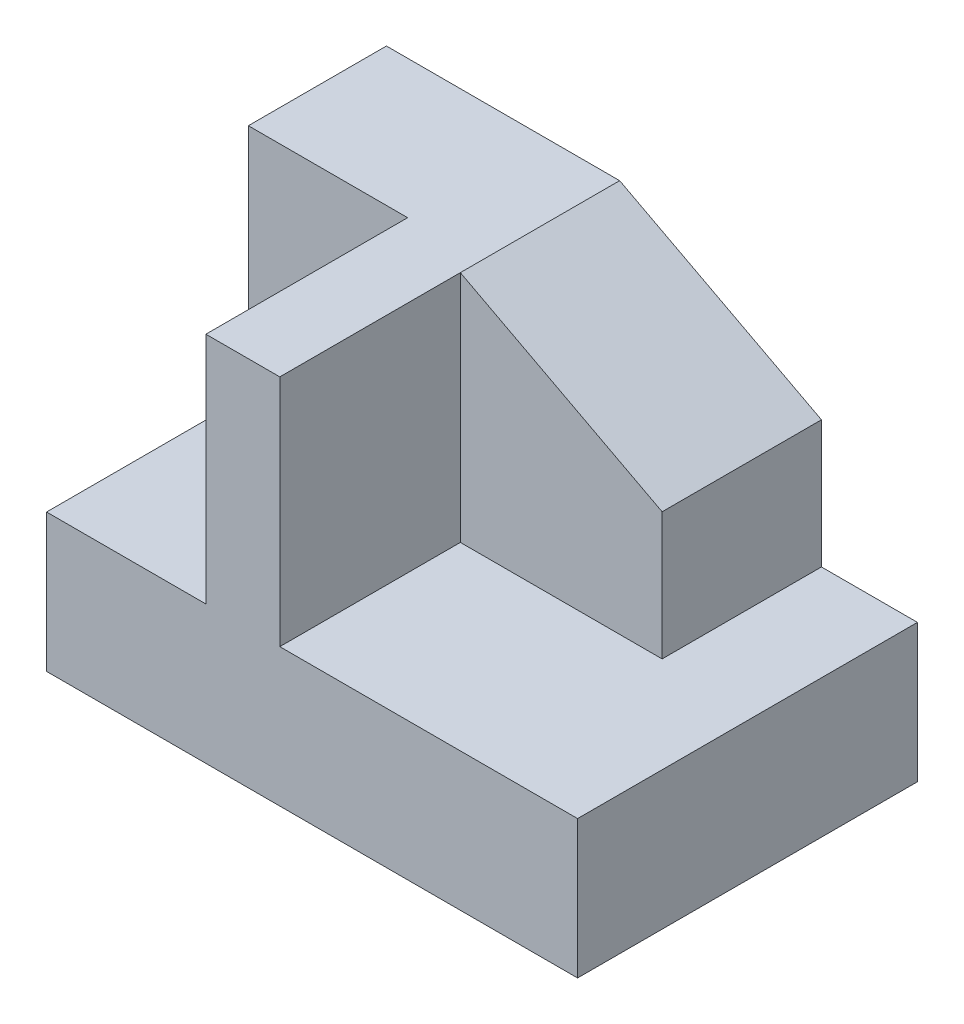
ISO-10303-21;
HEADER;
FILE_DESCRIPTION(('STEP AP214'),'2;1');
FILE_NAME('part.step','',(''),(''),'','','');
FILE_SCHEMA(('AUTOMOTIVE_DESIGN { 1 0 10303 214 1 1 1 1 }'));
ENDSEC;
DATA;
#1=APPLICATION_CONTEXT('core data for automotive mechanical design processes');
#2=APPLICATION_PROTOCOL_DEFINITION('international standard','automotive_design',2000,#1);
#3=PRODUCT_CONTEXT('',#1,'mechanical');
#4=PRODUCT('Part','Part','',(#3));
#5=PRODUCT_RELATED_PRODUCT_CATEGORY('part','',(#4));
#6=PRODUCT_DEFINITION_FORMATION('','',#4);
#7=PRODUCT_DEFINITION_CONTEXT('part definition',#1,'design');
#8=PRODUCT_DEFINITION('design','',#6,#7);
#9=PRODUCT_DEFINITION_SHAPE('','',#8);
#10=(LENGTH_UNIT() NAMED_UNIT(*) SI_UNIT(.MILLI.,.METRE.));
#11=(NAMED_UNIT(*) PLANE_ANGLE_UNIT() SI_UNIT($,.RADIAN.));
#12=(NAMED_UNIT(*) SI_UNIT($,.STERADIAN.) SOLID_ANGLE_UNIT());
#13=UNCERTAINTY_MEASURE_WITH_UNIT(LENGTH_MEASURE(1.E-05),#10,'distance_accuracy_value','');
#14=(GEOMETRIC_REPRESENTATION_CONTEXT(3) GLOBAL_UNCERTAINTY_ASSIGNED_CONTEXT((#13)) GLOBAL_UNIT_ASSIGNED_CONTEXT((#10,
#11,#12)) REPRESENTATION_CONTEXT('',''));
#15=CARTESIAN_POINT('',(0.,0.,0.));
#16=DIRECTION('',(0.,0.,1.));
#17=DIRECTION('',(1.,0.,0.));
#18=AXIS2_PLACEMENT_3D('',#15,#16,#17);
#19=CARTESIAN_POINT('',(-3.03861173426391,13.,-16.));
#20=DIRECTION('',(1.,0.,0.));
#21=DIRECTION('',(0.,0.,-1.));
#22=AXIS2_PLACEMENT_3D('',#19,#20,#21);
#23=PLANE('',#22);
#24=DIRECTION('',(0.,1.,0.));
#25=VECTOR('',#24,1.);
#26=CARTESIAN_POINT('',(-3.03861173426391,13.,-1.00000000000001));
#27=LINE('',#26,#25);
#28=CARTESIAN_POINT('',(-3.03861173426391,13.,-1.00000000000001));
#29=VERTEX_POINT('',#28);
#30=CARTESIAN_POINT('',(-3.03861173426391,35.,-1.00000000000001));
#31=VERTEX_POINT('',#30);
#32=EDGE_CURVE('E54',#29,#31,#27,.T.);
#33=ORIENTED_EDGE('',*,*,#32,.T.);
#34=DIRECTION('',(0.,0.,1.));
#35=VECTOR('',#34,1.);
#36=CARTESIAN_POINT('',(-3.03861173426391,35.,-16.));
#37=LINE('',#36,#35);
#38=CARTESIAN_POINT('',(-3.03861173426391,35.,16.));
#39=VERTEX_POINT('',#38);
#40=EDGE_CURVE('E169',#31,#39,#37,.T.);
#41=ORIENTED_EDGE('',*,*,#40,.T.);
#42=DIRECTION('',(0.,1.,0.));
#43=VECTOR('',#42,1.);
#44=CARTESIAN_POINT('',(-3.03861173426391,13.,16.));
#45=LINE('',#44,#43);
#46=CARTESIAN_POINT('',(-3.03861173426391,13.,16.));
#47=VERTEX_POINT('',#46);
#48=EDGE_CURVE('E158',#47,#39,#45,.T.);
#49=ORIENTED_EDGE('',*,*,#48,.F.);
#50=DIRECTION('',(0.,0.,1.));
#51=VECTOR('',#50,1.);
#52=CARTESIAN_POINT('',(-3.03861173426391,13.,-16.));
#53=LINE('',#52,#51);
#54=EDGE_CURVE('E170',#29,#47,#53,.T.);
#55=ORIENTED_EDGE('',*,*,#54,.F.);
#56=EDGE_LOOP('',(#33,#41,#49,#55));
#57=FACE_BOUND('',#56,.T.);
#58=ADVANCED_FACE('F39',(#57),#23,.T.);
#59=CARTESIAN_POINT('',(0.,13.,0.));
#60=DIRECTION('',(0.,-1.,0.));
#61=DIRECTION('',(0.,0.,-1.));
#62=AXIS2_PLACEMENT_3D('',#59,#60,#61);
#63=PLANE('',#62);
#64=DIRECTION('',(1.,0.,0.));
#65=VECTOR('',#64,1.);
#66=CARTESIAN_POINT('',(-25.,13.,16.));
#67=LINE('',#66,#65);
#68=CARTESIAN_POINT('',(-25.,13.,16.));
#69=VERTEX_POINT('',#68);
#70=CARTESIAN_POINT('',(-10.,13.,16.));
#71=VERTEX_POINT('',#70);
#72=EDGE_CURVE('E200',#69,#71,#67,.T.);
#73=ORIENTED_EDGE('',*,*,#72,.T.);
#74=DIRECTION('',(0.,0.,1.));
#75=VECTOR('',#74,1.);
#76=CARTESIAN_POINT('',(-10.,13.,-16.));
#77=LINE('',#76,#75);
#78=CARTESIAN_POINT('',(-10.,13.,-3.00000000000001));
#79=VERTEX_POINT('',#78);
#80=EDGE_CURVE('E164',#79,#71,#77,.T.);
#81=ORIENTED_EDGE('',*,*,#80,.F.);
#82=DIRECTION('',(-1.,0.,0.));
#83=VECTOR('',#82,1.);
#84=CARTESIAN_POINT('',(-25.,13.,-3.00000000000001));
#85=LINE('',#84,#83);
#86=CARTESIAN_POINT('',(-25.,13.,-3.00000000000001));
#87=VERTEX_POINT('',#86);
#88=EDGE_CURVE('E183',#79,#87,#85,.T.);
#89=ORIENTED_EDGE('',*,*,#88,.T.);
#90=DIRECTION('',(0.,0.,1.));
#91=VECTOR('',#90,1.);
#92=CARTESIAN_POINT('',(-25.,13.,16.));
#93=LINE('',#92,#91);
#94=EDGE_CURVE('E197',#87,#69,#93,.T.);
#95=ORIENTED_EDGE('',*,*,#94,.T.);
#96=EDGE_LOOP('',(#73,#81,#89,#95));
#97=FACE_BOUND('',#96,.T.);
#98=ADVANCED_FACE('F244',(#97),#63,.F.);
#99=DIRECTION('',(-1.,0.,0.));
#100=VECTOR('',#99,1.);
#101=CARTESIAN_POINT('',(-25.,13.,-16.));
#102=LINE('',#101,#100);
#103=CARTESIAN_POINT('',(25.,13.,-16.));
#104=VERTEX_POINT('',#103);
#105=CARTESIAN_POINT('',(15.9613882657361,13.,-16.));
#106=VERTEX_POINT('',#105);
#107=EDGE_CURVE('E194',#104,#106,#102,.T.);
#108=ORIENTED_EDGE('',*,*,#107,.T.);
#109=DIRECTION('',(0.,0.,-1.));
#110=VECTOR('',#109,1.);
#111=CARTESIAN_POINT('',(15.9613882657361,13.,-1.00000000000001));
#112=LINE('',#111,#110);
#113=CARTESIAN_POINT('',(15.9613882657361,13.,-1.00000000000001));
#114=VERTEX_POINT('',#113);
#115=EDGE_CURVE('E62',#114,#106,#112,.T.);
#116=ORIENTED_EDGE('',*,*,#115,.F.);
#117=DIRECTION('',(-1.,0.,0.));
#118=VECTOR('',#117,1.);
#119=CARTESIAN_POINT('',(-3.03861173426391,13.,-1.00000000000001));
#120=LINE('',#119,#118);
#121=EDGE_CURVE('E131',#114,#29,#120,.T.);
#122=ORIENTED_EDGE('',*,*,#121,.T.);
#123=ORIENTED_EDGE('',*,*,#54,.T.);
#124=CARTESIAN_POINT('',(25.,13.,16.));
#125=VERTEX_POINT('',#124);
#126=EDGE_CURVE('E199',#47,#125,#67,.T.);
#127=ORIENTED_EDGE('',*,*,#126,.T.);
#128=DIRECTION('',(0.,0.,-1.));
#129=VECTOR('',#128,1.);
#130=CARTESIAN_POINT('',(25.,13.,16.));
#131=LINE('',#130,#129);
#132=EDGE_CURVE('E191',#125,#104,#131,.T.);
#133=ORIENTED_EDGE('',*,*,#132,.T.);
#134=EDGE_LOOP('',(#108,#116,#122,#123,#127,#133));
#135=FACE_BOUND('',#134,.T.);
#136=ADVANCED_FACE('F233',(#135),#63,.F.);
#137=CARTESIAN_POINT('',(25.,13.,16.));
#138=DIRECTION('',(-1.,0.,0.));
#139=DIRECTION('',(0.,0.,1.));
#140=AXIS2_PLACEMENT_3D('',#137,#138,#139);
#141=PLANE('',#140);
#142=DIRECTION('',(0.,0.,-1.));
#143=VECTOR('',#142,1.);
#144=CARTESIAN_POINT('',(25.,0.,16.));
#145=LINE('',#144,#143);
#146=CARTESIAN_POINT('',(25.,0.,16.));
#147=VERTEX_POINT('',#146);
#148=CARTESIAN_POINT('',(25.,0.,-16.));
#149=VERTEX_POINT('',#148);
#150=EDGE_CURVE('E190',#147,#149,#145,.T.);
#151=ORIENTED_EDGE('',*,*,#150,.T.);
#152=DIRECTION('',(0.,-1.,0.));
#153=VECTOR('',#152,1.);
#154=CARTESIAN_POINT('',(25.,13.,-16.));
#155=LINE('',#154,#153);
#156=EDGE_CURVE('E11',#104,#149,#155,.T.);
#157=ORIENTED_EDGE('',*,*,#156,.F.);
#158=ORIENTED_EDGE('',*,*,#132,.F.);
#159=DIRECTION('',(0.,-1.,0.));
#160=VECTOR('',#159,1.);
#161=CARTESIAN_POINT('',(25.,13.,16.));
#162=LINE('',#161,#160);
#163=EDGE_CURVE('E202',#125,#147,#162,.T.);
#164=ORIENTED_EDGE('',*,*,#163,.T.);
#165=EDGE_LOOP('',(#151,#157,#158,#164));
#166=FACE_BOUND('',#165,.T.);
#167=ADVANCED_FACE('F41',(#166),#141,.F.);
#168=CARTESIAN_POINT('',(-25.,13.,-16.));
#169=DIRECTION('',(0.,0.,1.));
#170=DIRECTION('',(1.,0.,0.));
#171=AXIS2_PLACEMENT_3D('',#168,#169,#170);
#172=PLANE('',#171);
#173=DIRECTION('',(1.,0.,0.));
#174=VECTOR('',#173,1.);
#175=CARTESIAN_POINT('',(-25.,35.,-16.));
#176=LINE('',#175,#174);
#177=CARTESIAN_POINT('',(-25.,35.,-16.));
#178=VERTEX_POINT('',#177);
#179=CARTESIAN_POINT('',(-3.03861173426391,35.,-16.));
#180=VERTEX_POINT('',#179);
#181=EDGE_CURVE('E167',#178,#180,#176,.T.);
#182=ORIENTED_EDGE('',*,*,#181,.T.);
#183=DIRECTION('',(0.884918222381982,-0.465746432832622,0.));
#184=VECTOR('',#183,1.);
#185=CARTESIAN_POINT('',(15.9613882657361,25.,-16.));
#186=LINE('',#185,#184);
#187=CARTESIAN_POINT('',(15.9613882657361,25.,-16.));
#188=VERTEX_POINT('',#187);
#189=EDGE_CURVE('E147',#180,#188,#186,.T.);
#190=ORIENTED_EDGE('',*,*,#189,.T.);
#191=DIRECTION('',(0.,-1.,0.));
#192=VECTOR('',#191,1.);
#193=CARTESIAN_POINT('',(15.9613882657361,13.,-16.));
#194=LINE('',#193,#192);
#195=EDGE_CURVE('E138',#188,#106,#194,.T.);
#196=ORIENTED_EDGE('',*,*,#195,.T.);
#197=ORIENTED_EDGE('',*,*,#107,.F.);
#198=ORIENTED_EDGE('',*,*,#156,.T.);
#199=DIRECTION('',(-1.,0.,0.));
#200=VECTOR('',#199,1.);
#201=CARTESIAN_POINT('',(-25.,0.,-16.));
#202=LINE('',#201,#200);
#203=CARTESIAN_POINT('',(-25.,0.,-16.));
#204=VERTEX_POINT('',#203);
#205=EDGE_CURVE('E205',#149,#204,#202,.T.);
#206=ORIENTED_EDGE('',*,*,#205,.T.);
#207=DIRECTION('',(0.,-1.,0.));
#208=VECTOR('',#207,1.);
#209=CARTESIAN_POINT('',(-25.,13.,-16.));
#210=LINE('',#209,#208);
#211=EDGE_CURVE('E47',#178,#204,#210,.T.);
#212=ORIENTED_EDGE('',*,*,#211,.F.);
#213=EDGE_LOOP('',(#182,#190,#196,#197,#198,#206,#212));
#214=FACE_BOUND('',#213,.T.);
#215=ADVANCED_FACE('F249',(#214),#172,.F.);
#216=CARTESIAN_POINT('',(-25.,13.,16.));
#217=DIRECTION('',(1.,0.,0.));
#218=DIRECTION('',(0.,0.,-1.));
#219=AXIS2_PLACEMENT_3D('',#216,#217,#218);
#220=PLANE('',#219);
#221=DIRECTION('',(0.,0.,1.));
#222=VECTOR('',#221,1.);
#223=CARTESIAN_POINT('',(-25.,0.,16.));
#224=LINE('',#223,#222);
#225=CARTESIAN_POINT('',(-25.,0.,16.));
#226=VERTEX_POINT('',#225);
#227=EDGE_CURVE('E207',#204,#226,#224,.T.);
#228=ORIENTED_EDGE('',*,*,#227,.T.);
#229=DIRECTION('',(0.,-1.,0.));
#230=VECTOR('',#229,1.);
#231=CARTESIAN_POINT('',(-25.,13.,16.));
#232=LINE('',#231,#230);
#233=EDGE_CURVE('E212',#69,#226,#232,.T.);
#234=ORIENTED_EDGE('',*,*,#233,.F.);
#235=ORIENTED_EDGE('',*,*,#94,.F.);
#236=DIRECTION('',(0.,1.,0.));
#237=VECTOR('',#236,1.);
#238=CARTESIAN_POINT('',(-25.,13.,-3.00000000000001));
#239=LINE('',#238,#237);
#240=CARTESIAN_POINT('',(-25.,35.,-3.00000000000001));
#241=VERTEX_POINT('',#240);
#242=EDGE_CURVE('E174',#87,#241,#239,.T.);
#243=ORIENTED_EDGE('',*,*,#242,.T.);
#244=DIRECTION('',(0.,0.,-1.));
#245=VECTOR('',#244,1.);
#246=CARTESIAN_POINT('',(-25.,35.,-3.00000000000001));
#247=LINE('',#246,#245);
#248=EDGE_CURVE('E186',#241,#178,#247,.T.);
#249=ORIENTED_EDGE('',*,*,#248,.T.);
#250=ORIENTED_EDGE('',*,*,#211,.T.);
#251=EDGE_LOOP('',(#228,#234,#235,#243,#249,#250));
#252=FACE_BOUND('',#251,.T.);
#253=ADVANCED_FACE('F217',(#252),#220,.F.);
#254=CARTESIAN_POINT('',(-25.,13.,16.));
#255=DIRECTION('',(0.,0.,-1.));
#256=DIRECTION('',(-1.,0.,0.));
#257=AXIS2_PLACEMENT_3D('',#254,#255,#256);
#258=PLANE('',#257);
#259=DIRECTION('',(1.,0.,0.));
#260=VECTOR('',#259,1.);
#261=CARTESIAN_POINT('',(-25.,0.,16.));
#262=LINE('',#261,#260);
#263=EDGE_CURVE('E195',#226,#147,#262,.T.);
#264=ORIENTED_EDGE('',*,*,#263,.T.);
#265=ORIENTED_EDGE('',*,*,#163,.F.);
#266=ORIENTED_EDGE('',*,*,#126,.F.);
#267=ORIENTED_EDGE('',*,*,#48,.T.);
#268=DIRECTION('',(-1.,0.,0.));
#269=VECTOR('',#268,1.);
#270=CARTESIAN_POINT('',(-10.,35.,16.));
#271=LINE('',#270,#269);
#272=CARTESIAN_POINT('',(-10.,35.,16.));
#273=VERTEX_POINT('',#272);
#274=EDGE_CURVE('E161',#39,#273,#271,.T.);
#275=ORIENTED_EDGE('',*,*,#274,.T.);
#276=DIRECTION('',(0.,-1.,0.));
#277=VECTOR('',#276,1.);
#278=CARTESIAN_POINT('',(-10.,13.,16.));
#279=LINE('',#278,#277);
#280=EDGE_CURVE('E154',#273,#71,#279,.T.);
#281=ORIENTED_EDGE('',*,*,#280,.T.);
#282=ORIENTED_EDGE('',*,*,#72,.F.);
#283=ORIENTED_EDGE('',*,*,#233,.T.);
#284=EDGE_LOOP('',(#264,#265,#266,#267,#275,#281,#282,#283));
#285=FACE_BOUND('',#284,.T.);
#286=ADVANCED_FACE('F227',(#285),#258,.F.);
#287=CARTESIAN_POINT('',(0.,0.,0.));
#288=DIRECTION('',(0.,-1.,0.));
#289=DIRECTION('',(0.,0.,-1.));
#290=AXIS2_PLACEMENT_3D('',#287,#288,#289);
#291=PLANE('',#290);
#292=ORIENTED_EDGE('',*,*,#150,.F.);
#293=ORIENTED_EDGE('',*,*,#263,.F.);
#294=ORIENTED_EDGE('',*,*,#227,.F.);
#295=ORIENTED_EDGE('',*,*,#205,.F.);
#296=EDGE_LOOP('',(#292,#293,#294,#295));
#297=FACE_BOUND('',#296,.T.);
#298=ADVANCED_FACE('F224',(#297),#291,.T.);
#299=CARTESIAN_POINT('',(-25.,35.,-3.00000000000001));
#300=DIRECTION('',(0.,1.,0.));
#301=DIRECTION('',(0.,0.,1.));
#302=AXIS2_PLACEMENT_3D('',#299,#300,#301);
#303=PLANE('',#302);
#304=ORIENTED_EDGE('',*,*,#181,.F.);
#305=ORIENTED_EDGE('',*,*,#248,.F.);
#306=DIRECTION('',(1.,0.,0.));
#307=VECTOR('',#306,1.);
#308=CARTESIAN_POINT('',(-25.,35.,-3.00000000000001));
#309=LINE('',#308,#307);
#310=CARTESIAN_POINT('',(-10.,35.,-3.00000000000001));
#311=VERTEX_POINT('',#310);
#312=EDGE_CURVE('E177',#241,#311,#309,.T.);
#313=ORIENTED_EDGE('',*,*,#312,.T.);
#314=DIRECTION('',(0.,0.,1.));
#315=VECTOR('',#314,1.);
#316=CARTESIAN_POINT('',(-10.,35.,-16.));
#317=LINE('',#316,#315);
#318=EDGE_CURVE('E165',#311,#273,#317,.T.);
#319=ORIENTED_EDGE('',*,*,#318,.T.);
#320=ORIENTED_EDGE('',*,*,#274,.F.);
#321=ORIENTED_EDGE('',*,*,#40,.F.);
#322=EDGE_CURVE('E146',#180,#31,#37,.T.);
#323=ORIENTED_EDGE('',*,*,#322,.F.);
#324=EDGE_LOOP('',(#304,#305,#313,#319,#320,#321,#323));
#325=FACE_BOUND('',#324,.T.);
#326=ADVANCED_FACE('F237',(#325),#303,.T.);
#327=CARTESIAN_POINT('',(0.,0.,-3.00000000000001));
#328=DIRECTION('',(0.,0.,-1.));
#329=DIRECTION('',(-1.,0.,0.));
#330=AXIS2_PLACEMENT_3D('',#327,#328,#329);
#331=PLANE('',#330);
#332=ORIENTED_EDGE('',*,*,#242,.F.);
#333=ORIENTED_EDGE('',*,*,#88,.F.);
#334=DIRECTION('',(0.,-1.,0.));
#335=VECTOR('',#334,1.);
#336=CARTESIAN_POINT('',(-10.,13.,-3.00000000000001));
#337=LINE('',#336,#335);
#338=EDGE_CURVE('E180',#311,#79,#337,.T.);
#339=ORIENTED_EDGE('',*,*,#338,.F.);
#340=ORIENTED_EDGE('',*,*,#312,.F.);
#341=EDGE_LOOP('',(#332,#333,#339,#340));
#342=FACE_BOUND('',#341,.T.);
#343=ADVANCED_FACE('F248',(#342),#331,.F.);
#344=CARTESIAN_POINT('',(-10.,13.,-16.));
#345=DIRECTION('',(-1.,0.,0.));
#346=DIRECTION('',(0.,0.,1.));
#347=AXIS2_PLACEMENT_3D('',#344,#345,#346);
#348=PLANE('',#347);
#349=ORIENTED_EDGE('',*,*,#338,.T.);
#350=ORIENTED_EDGE('',*,*,#80,.T.);
#351=ORIENTED_EDGE('',*,*,#280,.F.);
#352=ORIENTED_EDGE('',*,*,#318,.F.);
#353=EDGE_LOOP('',(#349,#350,#351,#352));
#354=FACE_BOUND('',#353,.T.);
#355=ADVANCED_FACE('F241',(#354),#348,.T.);
#356=CARTESIAN_POINT('',(15.9613882657361,13.,-1.00000000000001));
#357=DIRECTION('',(1.,0.,0.));
#358=DIRECTION('',(0.,0.,-1.));
#359=AXIS2_PLACEMENT_3D('',#356,#357,#358);
#360=PLANE('',#359);
#361=ORIENTED_EDGE('',*,*,#195,.F.);
#362=DIRECTION('',(0.,0.,-1.));
#363=VECTOR('',#362,1.);
#364=CARTESIAN_POINT('',(15.9613882657361,25.,-1.00000000000001));
#365=LINE('',#364,#363);
#366=CARTESIAN_POINT('',(15.9613882657361,25.,-1.00000000000001));
#367=VERTEX_POINT('',#366);
#368=EDGE_CURVE('E135',#367,#188,#365,.T.);
#369=ORIENTED_EDGE('',*,*,#368,.F.);
#370=DIRECTION('',(0.,-1.,0.));
#371=VECTOR('',#370,1.);
#372=CARTESIAN_POINT('',(15.9613882657361,13.,-1.00000000000001));
#373=LINE('',#372,#371);
#374=EDGE_CURVE('E126',#367,#114,#373,.T.);
#375=ORIENTED_EDGE('',*,*,#374,.T.);
#376=ORIENTED_EDGE('',*,*,#115,.T.);
#377=EDGE_LOOP('',(#361,#369,#375,#376));
#378=FACE_BOUND('',#377,.T.);
#379=ADVANCED_FACE('F136',(#378),#360,.T.);
#380=CARTESIAN_POINT('',(0.,0.,-1.00000000000001));
#381=DIRECTION('',(0.,0.,-1.));
#382=DIRECTION('',(-1.,0.,0.));
#383=AXIS2_PLACEMENT_3D('',#380,#381,#382);
#384=PLANE('',#383);
#385=ORIENTED_EDGE('',*,*,#32,.F.);
#386=ORIENTED_EDGE('',*,*,#121,.F.);
#387=ORIENTED_EDGE('',*,*,#374,.F.);
#388=DIRECTION('',(0.884918222381982,-0.465746432832622,0.));
#389=VECTOR('',#388,1.);
#390=CARTESIAN_POINT('',(15.9613882657361,25.,-1.00000000000001));
#391=LINE('',#390,#389);
#392=EDGE_CURVE('E130',#31,#367,#391,.T.);
#393=ORIENTED_EDGE('',*,*,#392,.F.);
#394=EDGE_LOOP('',(#385,#386,#387,#393));
#395=FACE_BOUND('',#394,.T.);
#396=ADVANCED_FACE('F128',(#395),#384,.F.);
#397=CARTESIAN_POINT('',(15.9613882657361,25.,-1.00000000000001));
#398=DIRECTION('',(0.465746432832622,0.884918222381982,0.));
#399=DIRECTION('',(-0.884918222381983,0.465746432832622,0.));
#400=AXIS2_PLACEMENT_3D('',#397,#398,#399);
#401=PLANE('',#400);
#402=ORIENTED_EDGE('',*,*,#189,.F.);
#403=ORIENTED_EDGE('',*,*,#322,.T.);
#404=ORIENTED_EDGE('',*,*,#392,.T.);
#405=ORIENTED_EDGE('',*,*,#368,.T.);
#406=EDGE_LOOP('',(#402,#403,#404,#405));
#407=FACE_BOUND('',#406,.T.);
#408=ADVANCED_FACE('F144',(#407),#401,.T.);
#409=CLOSED_SHELL('',(#58,#98,#136,#167,#215,#253,#286,#298,#326,#343,#355,#379,#396,#408));
#410=MANIFOLD_SOLID_BREP('B2',#409);
#411=ADVANCED_BREP_SHAPE_REPRESENTATION('',(#18,#410),#14);
#412=SHAPE_DEFINITION_REPRESENTATION(#9,#411);
ENDSEC;
END-ISO-10303-21;
